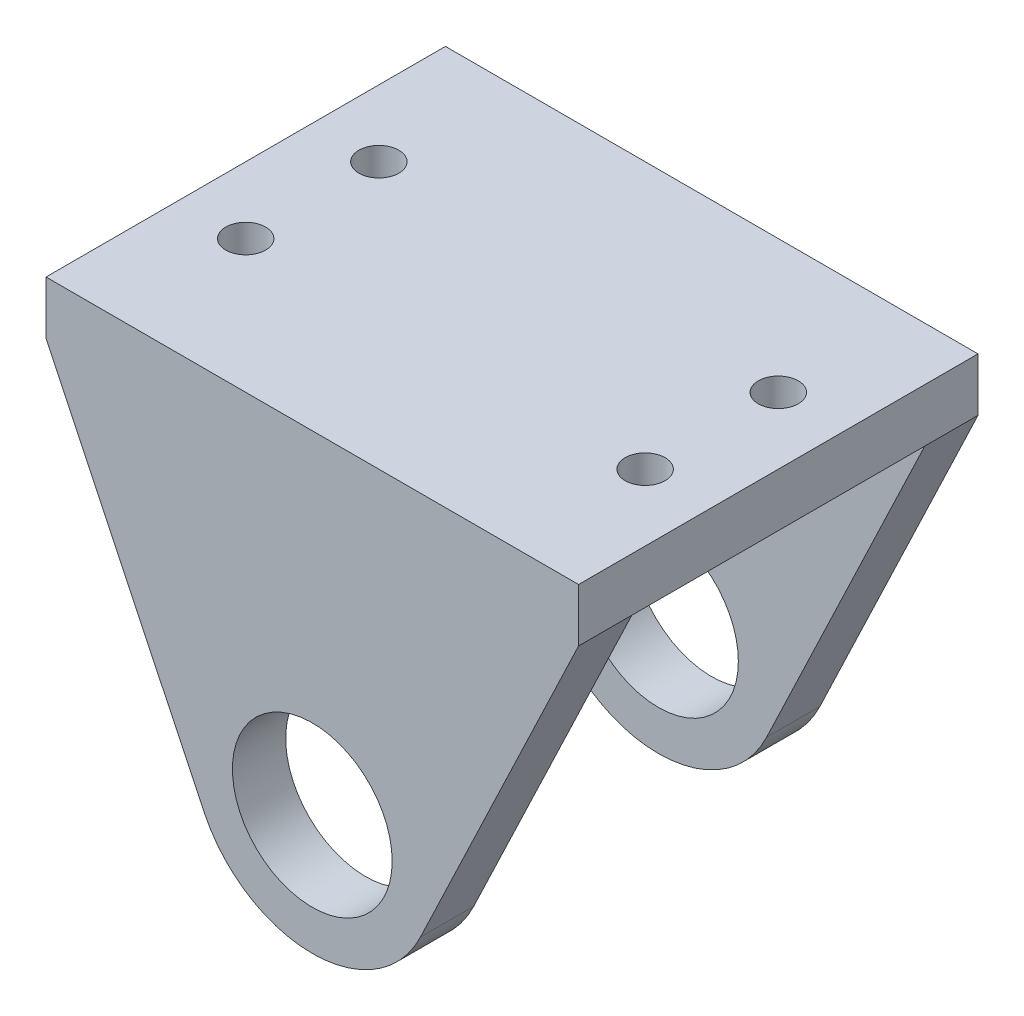
ISO-10303-21;
HEADER;
FILE_DESCRIPTION(('STEP AP214'),'2;1');
FILE_NAME('part.step','',(''),(''),'','','');
FILE_SCHEMA(('AUTOMOTIVE_DESIGN { 1 0 10303 214 1 1 1 1 }'));
ENDSEC;
DATA;
#1=APPLICATION_CONTEXT('core data for automotive mechanical design processes');
#2=APPLICATION_PROTOCOL_DEFINITION('international standard','automotive_design',2000,#1);
#3=PRODUCT_CONTEXT('',#1,'mechanical');
#4=PRODUCT('Part','Part','',(#3));
#5=PRODUCT_RELATED_PRODUCT_CATEGORY('part','',(#4));
#6=PRODUCT_DEFINITION_FORMATION('','',#4);
#7=PRODUCT_DEFINITION_CONTEXT('part definition',#1,'design');
#8=PRODUCT_DEFINITION('design','',#6,#7);
#9=PRODUCT_DEFINITION_SHAPE('','',#8);
#10=(LENGTH_UNIT() NAMED_UNIT(*) SI_UNIT(.MILLI.,.METRE.));
#11=(NAMED_UNIT(*) PLANE_ANGLE_UNIT() SI_UNIT($,.RADIAN.));
#12=(NAMED_UNIT(*) SI_UNIT($,.STERADIAN.) SOLID_ANGLE_UNIT());
#13=UNCERTAINTY_MEASURE_WITH_UNIT(LENGTH_MEASURE(1.E-05),#10,'distance_accuracy_value','');
#14=(GEOMETRIC_REPRESENTATION_CONTEXT(3) GLOBAL_UNCERTAINTY_ASSIGNED_CONTEXT((#13)) GLOBAL_UNIT_ASSIGNED_CONTEXT((#10,
#11,#12)) REPRESENTATION_CONTEXT('',''));
#15=CARTESIAN_POINT('',(0.,0.,0.));
#16=DIRECTION('',(0.,0.,1.));
#17=DIRECTION('',(1.,0.,0.));
#18=AXIS2_PLACEMENT_3D('',#15,#16,#17);
#19=CARTESIAN_POINT('',(20.,-4.,10.));
#20=DIRECTION('',(1.,0.,0.));
#21=DIRECTION('',(0.,0.,-1.));
#22=AXIS2_PLACEMENT_3D('',#19,#20,#21);
#23=PLANE('',#22);
#24=DIRECTION('',(0.,0.,-1.));
#25=VECTOR('',#24,1.);
#26=CARTESIAN_POINT('',(20.,0.,10.));
#27=LINE('',#26,#25);
#28=CARTESIAN_POINT('',(20.,0.,15.));
#29=VERTEX_POINT('',#28);
#30=CARTESIAN_POINT('',(20.,0.,-15.));
#31=VERTEX_POINT('',#30);
#32=EDGE_CURVE('E203',#29,#31,#27,.T.);
#33=ORIENTED_EDGE('',*,*,#32,.F.);
#34=DIRECTION('',(0.,1.,0.));
#35=VECTOR('',#34,1.);
#36=CARTESIAN_POINT('',(20.,-4.,15.));
#37=LINE('',#36,#35);
#38=CARTESIAN_POINT('',(20.,-4.,15.));
#39=VERTEX_POINT('',#38);
#40=EDGE_CURVE('E182',#39,#29,#37,.T.);
#41=ORIENTED_EDGE('',*,*,#40,.F.);
#42=DIRECTION('',(0.,0.,-1.));
#43=VECTOR('',#42,1.);
#44=CARTESIAN_POINT('',(20.,-4.,15.));
#45=LINE('',#44,#43);
#46=CARTESIAN_POINT('',(20.,-4.,11.));
#47=VERTEX_POINT('',#46);
#48=EDGE_CURVE('E130',#39,#47,#45,.T.);
#49=ORIENTED_EDGE('',*,*,#48,.T.);
#50=DIRECTION('',(0.,0.,-1.));
#51=VECTOR('',#50,1.);
#52=CARTESIAN_POINT('',(20.,-4.,10.));
#53=LINE('',#52,#51);
#54=CARTESIAN_POINT('',(20.,-4.,-11.));
#55=VERTEX_POINT('',#54);
#56=EDGE_CURVE('E55',#47,#55,#53,.T.);
#57=ORIENTED_EDGE('',*,*,#56,.T.);
#58=DIRECTION('',(0.,0.,1.));
#59=VECTOR('',#58,1.);
#60=CARTESIAN_POINT('',(20.,-4.,-15.));
#61=LINE('',#60,#59);
#62=CARTESIAN_POINT('',(20.,-4.,-15.));
#63=VERTEX_POINT('',#62);
#64=EDGE_CURVE('E127',#63,#55,#61,.T.);
#65=ORIENTED_EDGE('',*,*,#64,.F.);
#66=DIRECTION('',(0.,1.,0.));
#67=VECTOR('',#66,1.);
#68=CARTESIAN_POINT('',(20.,-4.,-15.));
#69=LINE('',#68,#67);
#70=EDGE_CURVE('E154',#63,#31,#69,.T.);
#71=ORIENTED_EDGE('',*,*,#70,.T.);
#72=EDGE_LOOP('',(#33,#41,#49,#57,#65,#71));
#73=FACE_BOUND('',#72,.T.);
#74=ADVANCED_FACE('F47',(#73),#23,.T.);
#75=CARTESIAN_POINT('',(-20.,-4.,10.));
#76=DIRECTION('',(-1.,0.,0.));
#77=DIRECTION('',(0.,0.,1.));
#78=AXIS2_PLACEMENT_3D('',#75,#76,#77);
#79=PLANE('',#78);
#80=DIRECTION('',(0.,0.,1.));
#81=VECTOR('',#80,1.);
#82=CARTESIAN_POINT('',(-20.,0.,10.));
#83=LINE('',#82,#81);
#84=CARTESIAN_POINT('',(-20.,0.,-15.));
#85=VERTEX_POINT('',#84);
#86=CARTESIAN_POINT('',(-20.,0.,15.));
#87=VERTEX_POINT('',#86);
#88=EDGE_CURVE('E131',#85,#87,#83,.T.);
#89=ORIENTED_EDGE('',*,*,#88,.F.);
#90=DIRECTION('',(0.,-1.,0.));
#91=VECTOR('',#90,1.);
#92=CARTESIAN_POINT('',(-20.,0.,-15.));
#93=LINE('',#92,#91);
#94=CARTESIAN_POINT('',(-20.,-4.,-15.));
#95=VERTEX_POINT('',#94);
#96=EDGE_CURVE('E319',#85,#95,#93,.T.);
#97=ORIENTED_EDGE('',*,*,#96,.T.);
#98=DIRECTION('',(0.,0.,1.));
#99=VECTOR('',#98,1.);
#100=CARTESIAN_POINT('',(-20.,-4.,-15.));
#101=LINE('',#100,#99);
#102=CARTESIAN_POINT('',(-20.,-4.,-11.));
#103=VERTEX_POINT('',#102);
#104=EDGE_CURVE('E153',#95,#103,#101,.T.);
#105=ORIENTED_EDGE('',*,*,#104,.T.);
#106=DIRECTION('',(0.,0.,1.));
#107=VECTOR('',#106,1.);
#108=CARTESIAN_POINT('',(-20.,-4.,10.));
#109=LINE('',#108,#107);
#110=CARTESIAN_POINT('',(-20.,-4.,11.));
#111=VERTEX_POINT('',#110);
#112=EDGE_CURVE('E11',#103,#111,#109,.T.);
#113=ORIENTED_EDGE('',*,*,#112,.T.);
#114=DIRECTION('',(0.,0.,-1.));
#115=VECTOR('',#114,1.);
#116=CARTESIAN_POINT('',(-20.,-4.,15.));
#117=LINE('',#116,#115);
#118=CARTESIAN_POINT('',(-20.,-4.,15.));
#119=VERTEX_POINT('',#118);
#120=EDGE_CURVE('E200',#119,#111,#117,.T.);
#121=ORIENTED_EDGE('',*,*,#120,.F.);
#122=DIRECTION('',(0.,-1.,0.));
#123=VECTOR('',#122,1.);
#124=CARTESIAN_POINT('',(-20.,0.,15.));
#125=LINE('',#124,#123);
#126=EDGE_CURVE('E188',#87,#119,#125,.T.);
#127=ORIENTED_EDGE('',*,*,#126,.F.);
#128=EDGE_LOOP('',(#89,#97,#105,#113,#121,#127));
#129=FACE_BOUND('',#128,.T.);
#130=ADVANCED_FACE('F241',(#129),#79,.T.);
#131=CARTESIAN_POINT('',(0.,-4.,0.));
#132=DIRECTION('',(0.,-1.,0.));
#133=DIRECTION('',(0.,0.,-1.));
#134=AXIS2_PLACEMENT_3D('',#131,#132,#133);
#135=PLANE('',#134);
#136=CARTESIAN_POINT('',(15.,-4.,5.));
#137=DIRECTION('',(0.,-1.,0.));
#138=DIRECTION('',(0.,0.,-1.));
#139=AXIS2_PLACEMENT_3D('',#136,#137,#138);
#140=CIRCLE('',#139,1.5);
#141=CARTESIAN_POINT('',(15.,-4.,3.5));
#142=VERTEX_POINT('',#141);
#143=EDGE_CURVE('E334',#142,#142,#140,.T.);
#144=ORIENTED_EDGE('',*,*,#143,.F.);
#145=EDGE_LOOP('',(#144));
#146=FACE_BOUND('',#145,.T.);
#147=CARTESIAN_POINT('',(-15.,-4.,-5.));
#148=DIRECTION('',(0.,-1.,0.));
#149=DIRECTION('',(0.,0.,1.));
#150=AXIS2_PLACEMENT_3D('',#147,#148,#149);
#151=CIRCLE('',#150,1.5);
#152=CARTESIAN_POINT('',(-15.,-4.,-3.5));
#153=VERTEX_POINT('',#152);
#154=EDGE_CURVE('E335',#153,#153,#151,.T.);
#155=ORIENTED_EDGE('',*,*,#154,.F.);
#156=EDGE_LOOP('',(#155));
#157=FACE_BOUND('',#156,.T.);
#158=CARTESIAN_POINT('',(15.,-4.,-5.));
#159=DIRECTION('',(0.,-1.,0.));
#160=DIRECTION('',(0.,0.,1.));
#161=AXIS2_PLACEMENT_3D('',#158,#159,#160);
#162=CIRCLE('',#161,1.5);
#163=CARTESIAN_POINT('',(15.,-4.,-3.5));
#164=VERTEX_POINT('',#163);
#165=EDGE_CURVE('E338',#164,#164,#162,.T.);
#166=ORIENTED_EDGE('',*,*,#165,.F.);
#167=EDGE_LOOP('',(#166));
#168=FACE_BOUND('',#167,.T.);
#169=CARTESIAN_POINT('',(-15.,-4.,5.));
#170=DIRECTION('',(0.,-1.,0.));
#171=DIRECTION('',(0.,0.,-1.));
#172=AXIS2_PLACEMENT_3D('',#169,#170,#171);
#173=CIRCLE('',#172,1.5);
#174=CARTESIAN_POINT('',(-15.,-4.,3.5));
#175=VERTEX_POINT('',#174);
#176=EDGE_CURVE('E216',#175,#175,#173,.T.);
#177=ORIENTED_EDGE('',*,*,#176,.F.);
#178=EDGE_LOOP('',(#177));
#179=FACE_BOUND('',#178,.T.);
#180=ORIENTED_EDGE('',*,*,#56,.F.);
#181=DIRECTION('',(1.,0.,0.));
#182=VECTOR('',#181,1.);
#183=CARTESIAN_POINT('',(20.,-4.,11.));
#184=LINE('',#183,#182);
#185=EDGE_CURVE('E167',#111,#47,#184,.T.);
#186=ORIENTED_EDGE('',*,*,#185,.F.);
#187=ORIENTED_EDGE('',*,*,#112,.F.);
#188=DIRECTION('',(1.,0.,0.));
#189=VECTOR('',#188,1.);
#190=CARTESIAN_POINT('',(20.,-4.,-11.));
#191=LINE('',#190,#189);
#192=EDGE_CURVE('E138',#103,#55,#191,.T.);
#193=ORIENTED_EDGE('',*,*,#192,.T.);
#194=EDGE_LOOP('',(#180,#186,#187,#193));
#195=FACE_BOUND('',#194,.T.);
#196=ADVANCED_FACE('F146',(#146,#157,#168,#179,#195),#135,.T.);
#197=CARTESIAN_POINT('',(0.,0.,0.));
#198=DIRECTION('',(0.,-1.,0.));
#199=DIRECTION('',(0.,0.,-1.));
#200=AXIS2_PLACEMENT_3D('',#197,#198,#199);
#201=PLANE('',#200);
#202=CARTESIAN_POINT('',(15.,0.,5.));
#203=DIRECTION('',(0.,-1.,0.));
#204=DIRECTION('',(0.,0.,-1.));
#205=AXIS2_PLACEMENT_3D('',#202,#203,#204);
#206=CIRCLE('',#205,1.5);
#207=CARTESIAN_POINT('',(15.,0.,3.5));
#208=VERTEX_POINT('',#207);
#209=EDGE_CURVE('E50',#208,#208,#206,.T.);
#210=ORIENTED_EDGE('',*,*,#209,.T.);
#211=EDGE_LOOP('',(#210));
#212=FACE_BOUND('',#211,.T.);
#213=CARTESIAN_POINT('',(-15.,0.,-5.));
#214=DIRECTION('',(0.,-1.,0.));
#215=DIRECTION('',(0.,0.,-1.));
#216=AXIS2_PLACEMENT_3D('',#213,#214,#215);
#217=CIRCLE('',#216,1.5);
#218=CARTESIAN_POINT('',(-15.,0.,-6.5));
#219=VERTEX_POINT('',#218);
#220=EDGE_CURVE('E218',#219,#219,#217,.T.);
#221=ORIENTED_EDGE('',*,*,#220,.T.);
#222=EDGE_LOOP('',(#221));
#223=FACE_BOUND('',#222,.T.);
#224=CARTESIAN_POINT('',(15.,0.,-5.));
#225=DIRECTION('',(0.,-1.,0.));
#226=DIRECTION('',(0.,0.,-1.));
#227=AXIS2_PLACEMENT_3D('',#224,#225,#226);
#228=CIRCLE('',#227,1.5);
#229=CARTESIAN_POINT('',(15.,0.,-6.5));
#230=VERTEX_POINT('',#229);
#231=EDGE_CURVE('E215',#230,#230,#228,.T.);
#232=ORIENTED_EDGE('',*,*,#231,.T.);
#233=EDGE_LOOP('',(#232));
#234=FACE_BOUND('',#233,.T.);
#235=CARTESIAN_POINT('',(-15.,0.,5.));
#236=DIRECTION('',(0.,-1.,0.));
#237=DIRECTION('',(0.,0.,-1.));
#238=AXIS2_PLACEMENT_3D('',#235,#236,#237);
#239=CIRCLE('',#238,1.5);
#240=CARTESIAN_POINT('',(-15.,0.,3.5));
#241=VERTEX_POINT('',#240);
#242=EDGE_CURVE('E212',#241,#241,#239,.T.);
#243=ORIENTED_EDGE('',*,*,#242,.T.);
#244=EDGE_LOOP('',(#243));
#245=FACE_BOUND('',#244,.T.);
#246=ORIENTED_EDGE('',*,*,#32,.T.);
#247=DIRECTION('',(-1.,0.,0.));
#248=VECTOR('',#247,1.);
#249=CARTESIAN_POINT('',(20.,0.,-15.));
#250=LINE('',#249,#248);
#251=EDGE_CURVE('E159',#31,#85,#250,.T.);
#252=ORIENTED_EDGE('',*,*,#251,.T.);
#253=ORIENTED_EDGE('',*,*,#88,.T.);
#254=DIRECTION('',(-1.,0.,0.));
#255=VECTOR('',#254,1.);
#256=CARTESIAN_POINT('',(20.,0.,15.));
#257=LINE('',#256,#255);
#258=EDGE_CURVE('E185',#29,#87,#257,.T.);
#259=ORIENTED_EDGE('',*,*,#258,.F.);
#260=EDGE_LOOP('',(#246,#252,#253,#259));
#261=FACE_BOUND('',#260,.T.);
#262=ADVANCED_FACE('F225',(#212,#223,#234,#245,#261),#201,.F.);
#263=CARTESIAN_POINT('',(0.,-25.,15.));
#264=DIRECTION('',(0.,0.,1.));
#265=DIRECTION('',(1.,0.,0.));
#266=AXIS2_PLACEMENT_3D('',#263,#264,#265);
#267=PLANE('',#266);
#268=DIRECTION('',(0.430870333036396,0.902413849688216,0.));
#269=VECTOR('',#268,1.);
#270=CARTESIAN_POINT('',(20.,-4.,15.));
#271=LINE('',#270,#269);
#272=CARTESIAN_POINT('',(8.12172464719394,-28.8778329973276,15.));
#273=VERTEX_POINT('',#272);
#274=EDGE_CURVE('E179',#273,#39,#271,.T.);
#275=ORIENTED_EDGE('',*,*,#274,.T.);
#276=ORIENTED_EDGE('',*,*,#40,.T.);
#277=ORIENTED_EDGE('',*,*,#258,.T.);
#278=ORIENTED_EDGE('',*,*,#126,.T.);
#279=DIRECTION('',(0.430870333036396,-0.902413849688216,0.));
#280=VECTOR('',#279,1.);
#281=CARTESIAN_POINT('',(-20.,-4.,15.));
#282=LINE('',#281,#280);
#283=CARTESIAN_POINT('',(-8.12172464719393,-28.8778329973276,15.));
#284=VERTEX_POINT('',#283);
#285=EDGE_CURVE('E190',#119,#284,#282,.T.);
#286=ORIENTED_EDGE('',*,*,#285,.T.);
#287=CARTESIAN_POINT('',(0.,-25.,15.));
#288=DIRECTION('',(0.,0.,1.));
#289=DIRECTION('',(1.,0.,0.));
#290=AXIS2_PLACEMENT_3D('',#287,#288,#289);
#291=CIRCLE('',#290,9.);
#292=EDGE_CURVE('E192',#284,#273,#291,.T.);
#293=ORIENTED_EDGE('',*,*,#292,.T.);
#294=EDGE_LOOP('',(#275,#276,#277,#278,#286,#293));
#295=FACE_BOUND('',#294,.T.);
#296=CARTESIAN_POINT('',(0.,-25.,15.));
#297=DIRECTION('',(0.,0.,1.));
#298=DIRECTION('',(1.,0.,0.));
#299=AXIS2_PLACEMENT_3D('',#296,#297,#298);
#300=CIRCLE('',#299,6.);
#301=CARTESIAN_POINT('',(6.,-25.,15.));
#302=VERTEX_POINT('',#301);
#303=EDGE_CURVE('E176',#302,#302,#300,.T.);
#304=ORIENTED_EDGE('',*,*,#303,.F.);
#305=EDGE_LOOP('',(#304));
#306=FACE_BOUND('',#305,.T.);
#307=ADVANCED_FACE('F255',(#295,#306),#267,.T.);
#308=CARTESIAN_POINT('',(20.,-4.,15.));
#309=DIRECTION('',(-0.902413849688216,0.430870333036396,0.));
#310=DIRECTION('',(-0.430870333036396,-0.902413849688216,0.));
#311=AXIS2_PLACEMENT_3D('',#308,#309,#310);
#312=PLANE('',#311);
#313=DIRECTION('',(0.,0.,-1.));
#314=VECTOR('',#313,1.);
#315=CARTESIAN_POINT('',(8.12172464719394,-28.8778329973276,15.));
#316=LINE('',#315,#314);
#317=CARTESIAN_POINT('',(8.12172464719394,-28.8778329973276,11.));
#318=VERTEX_POINT('',#317);
#319=EDGE_CURVE('E194',#273,#318,#316,.T.);
#320=ORIENTED_EDGE('',*,*,#319,.T.);
#321=DIRECTION('',(0.430870333036396,0.902413849688216,0.));
#322=VECTOR('',#321,1.);
#323=CARTESIAN_POINT('',(20.,-4.,11.));
#324=LINE('',#323,#322);
#325=EDGE_CURVE('E69',#318,#47,#324,.T.);
#326=ORIENTED_EDGE('',*,*,#325,.T.);
#327=ORIENTED_EDGE('',*,*,#48,.F.);
#328=ORIENTED_EDGE('',*,*,#274,.F.);
#329=EDGE_LOOP('',(#320,#326,#327,#328));
#330=FACE_BOUND('',#329,.T.);
#331=ADVANCED_FACE('F257',(#330),#312,.F.);
#332=CARTESIAN_POINT('',(-20.,-4.,15.));
#333=DIRECTION('',(0.902413849688216,0.430870333036396,0.));
#334=DIRECTION('',(-0.430870333036396,0.902413849688216,0.));
#335=AXIS2_PLACEMENT_3D('',#332,#333,#334);
#336=PLANE('',#335);
#337=ORIENTED_EDGE('',*,*,#120,.T.);
#338=DIRECTION('',(0.430870333036396,-0.902413849688216,0.));
#339=VECTOR('',#338,1.);
#340=CARTESIAN_POINT('',(-20.,-4.,11.));
#341=LINE('',#340,#339);
#342=CARTESIAN_POINT('',(-8.12172464719394,-28.8778329973276,11.));
#343=VERTEX_POINT('',#342);
#344=EDGE_CURVE('E172',#111,#343,#341,.T.);
#345=ORIENTED_EDGE('',*,*,#344,.T.);
#346=DIRECTION('',(0.,0.,-1.));
#347=VECTOR('',#346,1.);
#348=CARTESIAN_POINT('',(-8.12172464719393,-28.8778329973276,15.));
#349=LINE('',#348,#347);
#350=EDGE_CURVE('E197',#284,#343,#349,.T.);
#351=ORIENTED_EDGE('',*,*,#350,.F.);
#352=ORIENTED_EDGE('',*,*,#285,.F.);
#353=EDGE_LOOP('',(#337,#345,#351,#352));
#354=FACE_BOUND('',#353,.T.);
#355=ADVANCED_FACE('F260',(#354),#336,.F.);
#356=CARTESIAN_POINT('',(0.,-25.,15.));
#357=DIRECTION('',(0.,0.,-1.));
#358=DIRECTION('',(-1.,0.,0.));
#359=AXIS2_PLACEMENT_3D('',#356,#357,#358);
#360=CYLINDRICAL_SURFACE('',#359,9.);
#361=ORIENTED_EDGE('',*,*,#350,.T.);
#362=CARTESIAN_POINT('',(0.,-25.,11.));
#363=DIRECTION('',(0.,0.,1.));
#364=DIRECTION('',(1.,0.,0.));
#365=AXIS2_PLACEMENT_3D('',#362,#363,#364);
#366=CIRCLE('',#365,9.);
#367=EDGE_CURVE('E170',#343,#318,#366,.T.);
#368=ORIENTED_EDGE('',*,*,#367,.T.);
#369=ORIENTED_EDGE('',*,*,#319,.F.);
#370=ORIENTED_EDGE('',*,*,#292,.F.);
#371=EDGE_LOOP('',(#361,#368,#369,#370));
#372=FACE_BOUND('',#371,.T.);
#373=ADVANCED_FACE('F264',(#372),#360,.T.);
#374=CARTESIAN_POINT('',(0.,-25.,15.));
#375=DIRECTION('',(0.,0.,-1.));
#376=DIRECTION('',(-1.,0.,0.));
#377=AXIS2_PLACEMENT_3D('',#374,#375,#376);
#378=CYLINDRICAL_SURFACE('',#377,6.);
#379=CARTESIAN_POINT('',(0.,-25.,11.));
#380=DIRECTION('',(0.,0.,1.));
#381=DIRECTION('',(1.,0.,0.));
#382=AXIS2_PLACEMENT_3D('',#379,#380,#381);
#383=CIRCLE('',#382,6.);
#384=CARTESIAN_POINT('',(6.,-25.,11.));
#385=VERTEX_POINT('',#384);
#386=EDGE_CURVE('E169',#385,#385,#383,.T.);
#387=ORIENTED_EDGE('',*,*,#386,.F.);
#388=EDGE_LOOP('',(#387));
#389=FACE_BOUND('',#388,.T.);
#390=ORIENTED_EDGE('',*,*,#303,.T.);
#391=EDGE_LOOP('',(#390));
#392=FACE_BOUND('',#391,.T.);
#393=ADVANCED_FACE('F268',(#389,#392),#378,.F.);
#394=CARTESIAN_POINT('',(0.,0.,11.));
#395=DIRECTION('',(0.,0.,1.));
#396=DIRECTION('',(1.,0.,0.));
#397=AXIS2_PLACEMENT_3D('',#394,#395,#396);
#398=PLANE('',#397);
#399=ORIENTED_EDGE('',*,*,#386,.T.);
#400=EDGE_LOOP('',(#399));
#401=FACE_BOUND('',#400,.T.);
#402=ORIENTED_EDGE('',*,*,#367,.F.);
#403=ORIENTED_EDGE('',*,*,#344,.F.);
#404=ORIENTED_EDGE('',*,*,#185,.T.);
#405=ORIENTED_EDGE('',*,*,#325,.F.);
#406=EDGE_LOOP('',(#402,#403,#404,#405));
#407=FACE_BOUND('',#406,.T.);
#408=ADVANCED_FACE('F275',(#401,#407),#398,.F.);
#409=CARTESIAN_POINT('',(20.,-4.,-15.));
#410=DIRECTION('',(0.902413849688216,-0.430870333036396,0.));
#411=DIRECTION('',(0.430870333036396,0.902413849688216,0.));
#412=AXIS2_PLACEMENT_3D('',#409,#410,#411);
#413=PLANE('',#412);
#414=DIRECTION('',(0.430870333036396,0.902413849688216,0.));
#415=VECTOR('',#414,1.);
#416=CARTESIAN_POINT('',(20.,-4.,-11.));
#417=LINE('',#416,#415);
#418=CARTESIAN_POINT('',(8.12172464719394,-28.8778329973276,-11.));
#419=VERTEX_POINT('',#418);
#420=EDGE_CURVE('E135',#419,#55,#417,.T.);
#421=ORIENTED_EDGE('',*,*,#420,.F.);
#422=DIRECTION('',(0.,0.,1.));
#423=VECTOR('',#422,1.);
#424=CARTESIAN_POINT('',(8.12172464719394,-28.8778329973276,-15.));
#425=LINE('',#424,#423);
#426=CARTESIAN_POINT('',(8.12172464719394,-28.8778329973276,-15.));
#427=VERTEX_POINT('',#426);
#428=EDGE_CURVE('E165',#427,#419,#425,.T.);
#429=ORIENTED_EDGE('',*,*,#428,.F.);
#430=DIRECTION('',(0.430870333036396,0.902413849688216,0.));
#431=VECTOR('',#430,1.);
#432=CARTESIAN_POINT('',(20.,-4.,-15.));
#433=LINE('',#432,#431);
#434=EDGE_CURVE('E151',#427,#63,#433,.T.);
#435=ORIENTED_EDGE('',*,*,#434,.T.);
#436=ORIENTED_EDGE('',*,*,#64,.T.);
#437=EDGE_LOOP('',(#421,#429,#435,#436));
#438=FACE_BOUND('',#437,.T.);
#439=ADVANCED_FACE('F149',(#438),#413,.T.);
#440=CARTESIAN_POINT('',(0.,-25.,-15.));
#441=DIRECTION('',(0.,0.,1.));
#442=DIRECTION('',(1.,0.,0.));
#443=AXIS2_PLACEMENT_3D('',#440,#441,#442);
#444=CYLINDRICAL_SURFACE('',#443,9.);
#445=CARTESIAN_POINT('',(0.,-25.,-11.));
#446=DIRECTION('',(0.,0.,-1.));
#447=DIRECTION('',(-1.,0.,0.));
#448=AXIS2_PLACEMENT_3D('',#445,#446,#447);
#449=CIRCLE('',#448,9.);
#450=CARTESIAN_POINT('',(-8.12172464719394,-28.8778329973276,-11.));
#451=VERTEX_POINT('',#450);
#452=EDGE_CURVE('E141',#451,#419,#449,.F.);
#453=ORIENTED_EDGE('',*,*,#452,.F.);
#454=DIRECTION('',(0.,0.,1.));
#455=VECTOR('',#454,1.);
#456=CARTESIAN_POINT('',(-8.12172464719393,-28.8778329973276,-15.));
#457=LINE('',#456,#455);
#458=CARTESIAN_POINT('',(-8.12172464719393,-28.8778329973276,-15.));
#459=VERTEX_POINT('',#458);
#460=EDGE_CURVE('E157',#459,#451,#457,.T.);
#461=ORIENTED_EDGE('',*,*,#460,.F.);
#462=CARTESIAN_POINT('',(0.,-25.,-15.));
#463=DIRECTION('',(0.,0.,1.));
#464=DIRECTION('',(1.,0.,0.));
#465=AXIS2_PLACEMENT_3D('',#462,#463,#464);
#466=CIRCLE('',#465,9.);
#467=EDGE_CURVE('E325',#459,#427,#466,.T.);
#468=ORIENTED_EDGE('',*,*,#467,.T.);
#469=ORIENTED_EDGE('',*,*,#428,.T.);
#470=EDGE_LOOP('',(#453,#461,#468,#469));
#471=FACE_BOUND('',#470,.T.);
#472=ADVANCED_FACE('F281',(#471),#444,.T.);
#473=CARTESIAN_POINT('',(-20.,-4.,-15.));
#474=DIRECTION('',(-0.902413849688216,-0.430870333036396,0.));
#475=DIRECTION('',(0.430870333036396,-0.902413849688216,0.));
#476=AXIS2_PLACEMENT_3D('',#473,#474,#475);
#477=PLANE('',#476);
#478=DIRECTION('',(0.430870333036396,-0.902413849688216,0.));
#479=VECTOR('',#478,1.);
#480=CARTESIAN_POINT('',(-20.,-4.,-11.));
#481=LINE('',#480,#479);
#482=EDGE_CURVE('E211',#103,#451,#481,.T.);
#483=ORIENTED_EDGE('',*,*,#482,.F.);
#484=ORIENTED_EDGE('',*,*,#104,.F.);
#485=DIRECTION('',(0.430870333036396,-0.902413849688216,0.));
#486=VECTOR('',#485,1.);
#487=CARTESIAN_POINT('',(-20.,-4.,-15.));
#488=LINE('',#487,#486);
#489=EDGE_CURVE('E320',#95,#459,#488,.T.);
#490=ORIENTED_EDGE('',*,*,#489,.T.);
#491=ORIENTED_EDGE('',*,*,#460,.T.);
#492=EDGE_LOOP('',(#483,#484,#490,#491));
#493=FACE_BOUND('',#492,.T.);
#494=ADVANCED_FACE('F284',(#493),#477,.T.);
#495=CARTESIAN_POINT('',(0.,-25.,-15.));
#496=DIRECTION('',(0.,0.,-1.));
#497=DIRECTION('',(1.,0.,0.));
#498=AXIS2_PLACEMENT_3D('',#495,#496,#497);
#499=PLANE('',#498);
#500=CARTESIAN_POINT('',(0.,-25.,-15.));
#501=DIRECTION('',(0.,0.,1.));
#502=DIRECTION('',(1.,0.,0.));
#503=AXIS2_PLACEMENT_3D('',#500,#501,#502);
#504=CIRCLE('',#503,6.);
#505=CARTESIAN_POINT('',(6.,-25.,-15.));
#506=VERTEX_POINT('',#505);
#507=EDGE_CURVE('E144',#506,#506,#504,.T.);
#508=ORIENTED_EDGE('',*,*,#507,.T.);
#509=EDGE_LOOP('',(#508));
#510=FACE_BOUND('',#509,.T.);
#511=ORIENTED_EDGE('',*,*,#434,.F.);
#512=ORIENTED_EDGE('',*,*,#467,.F.);
#513=ORIENTED_EDGE('',*,*,#489,.F.);
#514=ORIENTED_EDGE('',*,*,#96,.F.);
#515=ORIENTED_EDGE('',*,*,#251,.F.);
#516=ORIENTED_EDGE('',*,*,#70,.F.);
#517=EDGE_LOOP('',(#511,#512,#513,#514,#515,#516));
#518=FACE_BOUND('',#517,.T.);
#519=ADVANCED_FACE('F288',(#510,#518),#499,.T.);
#520=CARTESIAN_POINT('',(0.,-25.,-15.));
#521=DIRECTION('',(0.,0.,1.));
#522=DIRECTION('',(1.,0.,0.));
#523=AXIS2_PLACEMENT_3D('',#520,#521,#522);
#524=CYLINDRICAL_SURFACE('',#523,6.);
#525=CARTESIAN_POINT('',(0.,-25.,-11.));
#526=DIRECTION('',(0.,0.,-1.));
#527=DIRECTION('',(-1.,0.,0.));
#528=AXIS2_PLACEMENT_3D('',#525,#526,#527);
#529=CIRCLE('',#528,6.);
#530=CARTESIAN_POINT('',(-6.,-25.,-11.));
#531=VERTEX_POINT('',#530);
#532=EDGE_CURVE('E147',#531,#531,#529,.F.);
#533=ORIENTED_EDGE('',*,*,#532,.T.);
#534=EDGE_LOOP('',(#533));
#535=FACE_BOUND('',#534,.T.);
#536=ORIENTED_EDGE('',*,*,#507,.F.);
#537=EDGE_LOOP('',(#536));
#538=FACE_BOUND('',#537,.T.);
#539=ADVANCED_FACE('F292',(#535,#538),#524,.F.);
#540=CARTESIAN_POINT('',(0.,0.,-11.));
#541=DIRECTION('',(0.,0.,-1.));
#542=DIRECTION('',(1.,0.,0.));
#543=AXIS2_PLACEMENT_3D('',#540,#541,#542);
#544=PLANE('',#543);
#545=ORIENTED_EDGE('',*,*,#420,.T.);
#546=ORIENTED_EDGE('',*,*,#192,.F.);
#547=ORIENTED_EDGE('',*,*,#482,.T.);
#548=ORIENTED_EDGE('',*,*,#452,.T.);
#549=EDGE_LOOP('',(#545,#546,#547,#548));
#550=FACE_BOUND('',#549,.T.);
#551=ORIENTED_EDGE('',*,*,#532,.F.);
#552=EDGE_LOOP('',(#551));
#553=FACE_BOUND('',#552,.T.);
#554=ADVANCED_FACE('F136',(#550,#553),#544,.F.);
#555=CARTESIAN_POINT('',(-15.,6.,5.));
#556=DIRECTION('',(0.,-1.,0.));
#557=DIRECTION('',(0.,0.,-1.));
#558=AXIS2_PLACEMENT_3D('',#555,#556,#557);
#559=CYLINDRICAL_SURFACE('',#558,1.5);
#560=ORIENTED_EDGE('',*,*,#176,.T.);
#561=EDGE_LOOP('',(#560));
#562=FACE_BOUND('',#561,.T.);
#563=ORIENTED_EDGE('',*,*,#242,.F.);
#564=EDGE_LOOP('',(#563));
#565=FACE_BOUND('',#564,.T.);
#566=ADVANCED_FACE('F299',(#562,#565),#559,.F.);
#567=CARTESIAN_POINT('',(15.,6.,-5.));
#568=DIRECTION('',(0.,-1.,0.));
#569=DIRECTION('',(0.,0.,-1.));
#570=AXIS2_PLACEMENT_3D('',#567,#568,#569);
#571=CYLINDRICAL_SURFACE('',#570,1.5);
#572=ORIENTED_EDGE('',*,*,#165,.T.);
#573=EDGE_LOOP('',(#572));
#574=FACE_BOUND('',#573,.T.);
#575=ORIENTED_EDGE('',*,*,#231,.F.);
#576=EDGE_LOOP('',(#575));
#577=FACE_BOUND('',#576,.T.);
#578=ADVANCED_FACE('F235',(#574,#577),#571,.F.);
#579=CARTESIAN_POINT('',(-15.,6.,-5.));
#580=DIRECTION('',(0.,-1.,0.));
#581=DIRECTION('',(0.,0.,-1.));
#582=AXIS2_PLACEMENT_3D('',#579,#580,#581);
#583=CYLINDRICAL_SURFACE('',#582,1.5);
#584=ORIENTED_EDGE('',*,*,#154,.T.);
#585=EDGE_LOOP('',(#584));
#586=FACE_BOUND('',#585,.T.);
#587=ORIENTED_EDGE('',*,*,#220,.F.);
#588=EDGE_LOOP('',(#587));
#589=FACE_BOUND('',#588,.T.);
#590=ADVANCED_FACE('F229',(#586,#589),#583,.F.);
#591=CARTESIAN_POINT('',(15.,6.,5.));
#592=DIRECTION('',(0.,-1.,0.));
#593=DIRECTION('',(0.,0.,-1.));
#594=AXIS2_PLACEMENT_3D('',#591,#592,#593);
#595=CYLINDRICAL_SURFACE('',#594,1.5);
#596=ORIENTED_EDGE('',*,*,#143,.T.);
#597=EDGE_LOOP('',(#596));
#598=FACE_BOUND('',#597,.T.);
#599=ORIENTED_EDGE('',*,*,#209,.F.);
#600=EDGE_LOOP('',(#599));
#601=FACE_BOUND('',#600,.T.);
#602=ADVANCED_FACE('F227',(#598,#601),#595,.F.);
#603=CLOSED_SHELL('',(#74,#130,#196,#262,#307,#331,#355,#373,#393,#408,#439,#472,#494,#519,#539,
#554,#566,#578,#590,#602));
#604=MANIFOLD_SOLID_BREP('B2',#603);
#605=ADVANCED_BREP_SHAPE_REPRESENTATION('',(#18,#604),#14);
#606=SHAPE_DEFINITION_REPRESENTATION(#9,#605);
ENDSEC;
END-ISO-10303-21;
